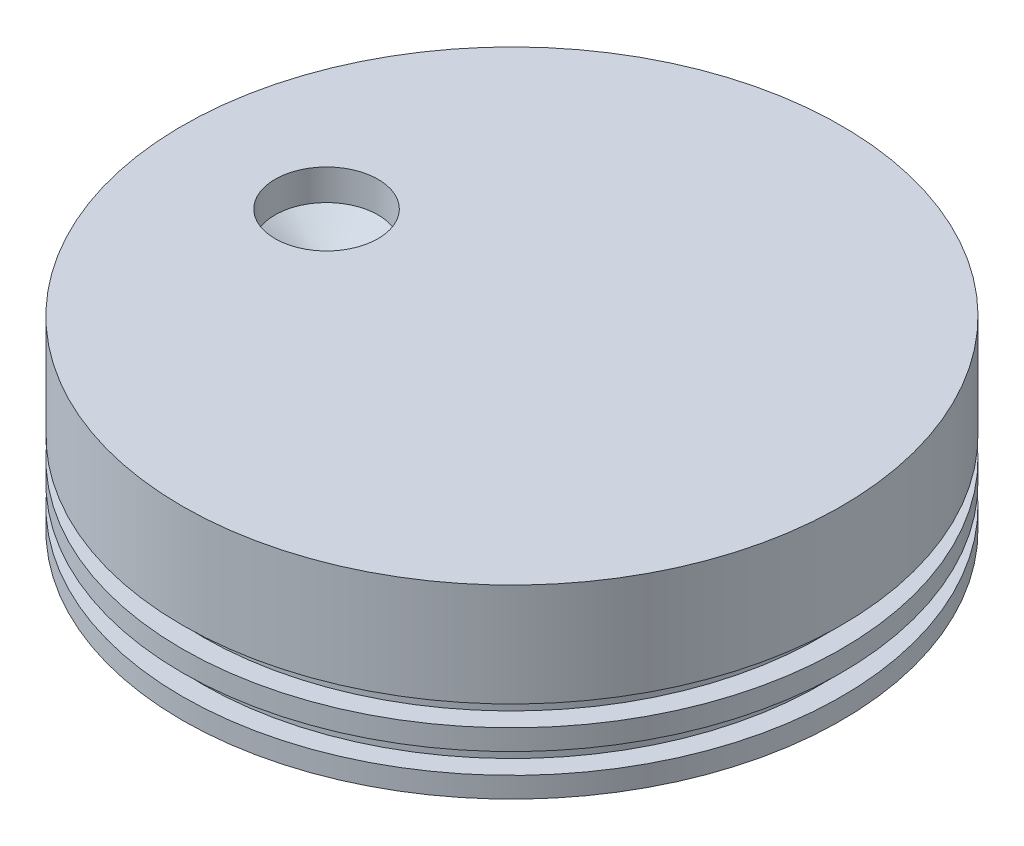
ISO-10303-21;
HEADER;
FILE_DESCRIPTION(('STEP AP214'),'2;1');
FILE_NAME('part.step','',(''),(''),'','','');
FILE_SCHEMA(('AUTOMOTIVE_DESIGN { 1 0 10303 214 1 1 1 1 }'));
ENDSEC;
DATA;
#1=APPLICATION_CONTEXT('core data for automotive mechanical design processes');
#2=APPLICATION_PROTOCOL_DEFINITION('international standard','automotive_design',2000,#1);
#3=PRODUCT_CONTEXT('',#1,'mechanical');
#4=PRODUCT('Part','Part','',(#3));
#5=PRODUCT_RELATED_PRODUCT_CATEGORY('part','',(#4));
#6=PRODUCT_DEFINITION_FORMATION('','',#4);
#7=PRODUCT_DEFINITION_CONTEXT('part definition',#1,'design');
#8=PRODUCT_DEFINITION('design','',#6,#7);
#9=PRODUCT_DEFINITION_SHAPE('','',#8);
#10=(LENGTH_UNIT() NAMED_UNIT(*) SI_UNIT(.MILLI.,.METRE.));
#11=(NAMED_UNIT(*) PLANE_ANGLE_UNIT() SI_UNIT($,.RADIAN.));
#12=(NAMED_UNIT(*) SI_UNIT($,.STERADIAN.) SOLID_ANGLE_UNIT());
#13=UNCERTAINTY_MEASURE_WITH_UNIT(LENGTH_MEASURE(1.E-05),#10,'distance_accuracy_value','');
#14=(GEOMETRIC_REPRESENTATION_CONTEXT(3) GLOBAL_UNCERTAINTY_ASSIGNED_CONTEXT((#13)) GLOBAL_UNIT_ASSIGNED_CONTEXT((#10,
#11,#12)) REPRESENTATION_CONTEXT('',''));
#15=CARTESIAN_POINT('',(0.,0.,0.));
#16=DIRECTION('',(0.,0.,1.));
#17=DIRECTION('',(1.,0.,0.));
#18=AXIS2_PLACEMENT_3D('',#15,#16,#17);
#19=CARTESIAN_POINT('',(20.32,0.,0.));
#20=DIRECTION('',(0.,1.,0.));
#21=DIRECTION('',(0.,0.,1.));
#22=AXIS2_PLACEMENT_3D('',#19,#20,#21);
#23=CYLINDRICAL_SURFACE('',#22,20.32);
#24=CARTESIAN_POINT('',(20.32,-6.35,0.));
#25=DIRECTION('',(0.,1.,0.));
#26=DIRECTION('',(0.,0.,1.));
#27=AXIS2_PLACEMENT_3D('',#24,#25,#26);
#28=CIRCLE('',#27,20.32);
#29=CARTESIAN_POINT('',(20.32,-6.35,20.32));
#30=VERTEX_POINT('',#29);
#31=EDGE_CURVE('E66',#30,#30,#28,.T.);
#32=ORIENTED_EDGE('',*,*,#31,.T.);
#33=EDGE_LOOP('',(#32));
#34=FACE_BOUND('',#33,.T.);
#35=CARTESIAN_POINT('',(20.32,0.,0.));
#36=DIRECTION('',(0.,1.,0.));
#37=DIRECTION('',(0.,0.,1.));
#38=AXIS2_PLACEMENT_3D('',#35,#36,#37);
#39=CIRCLE('',#38,20.32);
#40=CARTESIAN_POINT('',(20.32,0.,20.32));
#41=VERTEX_POINT('',#40);
#42=EDGE_CURVE('E11',#41,#41,#39,.T.);
#43=ORIENTED_EDGE('',*,*,#42,.F.);
#44=EDGE_LOOP('',(#43));
#45=FACE_BOUND('',#44,.T.);
#46=ADVANCED_FACE('F45',(#34,#45),#23,.T.);
#47=CARTESIAN_POINT('',(0.,0.,0.));
#48=DIRECTION('',(0.,1.,0.));
#49=DIRECTION('',(0.,0.,1.));
#50=AXIS2_PLACEMENT_3D('',#47,#48,#49);
#51=PLANE('',#50);
#52=CARTESIAN_POINT('',(8.89,0.,0.));
#53=DIRECTION('',(0.,1.,0.));
#54=DIRECTION('',(0.,0.,1.));
#55=AXIS2_PLACEMENT_3D('',#52,#53,#54);
#56=CIRCLE('',#55,3.17499999999999);
#57=CARTESIAN_POINT('',(8.89,0.,3.17499999999999));
#58=VERTEX_POINT('',#57);
#59=EDGE_CURVE('E67',#58,#58,#56,.T.);
#60=ORIENTED_EDGE('',*,*,#59,.F.);
#61=EDGE_LOOP('',(#60));
#62=FACE_BOUND('',#61,.T.);
#63=ORIENTED_EDGE('',*,*,#42,.T.);
#64=EDGE_LOOP('',(#63));
#65=FACE_BOUND('',#64,.T.);
#66=ADVANCED_FACE('F112',(#62,#65),#51,.T.);
#67=CARTESIAN_POINT('',(20.32,-11.43,0.));
#68=DIRECTION('',(0.,-1.,0.));
#69=DIRECTION('',(0.,0.,-1.));
#70=AXIS2_PLACEMENT_3D('',#67,#68,#69);
#71=PLANE('',#70);
#72=CARTESIAN_POINT('',(20.32,-11.43,0.));
#73=DIRECTION('',(0.,1.,0.));
#74=DIRECTION('',(0.,0.,1.));
#75=AXIS2_PLACEMENT_3D('',#72,#73,#74);
#76=CIRCLE('',#75,20.32);
#77=CARTESIAN_POINT('',(20.32,-11.43,20.32));
#78=VERTEX_POINT('',#77);
#79=EDGE_CURVE('E52',#78,#78,#76,.T.);
#80=ORIENTED_EDGE('',*,*,#79,.F.);
#81=EDGE_LOOP('',(#80));
#82=FACE_BOUND('',#81,.T.);
#83=ADVANCED_FACE('F110',(#82),#71,.T.);
#84=CARTESIAN_POINT('',(20.32,0.,0.));
#85=DIRECTION('',(0.,1.,0.));
#86=DIRECTION('',(0.,0.,1.));
#87=AXIS2_PLACEMENT_3D('',#84,#85,#86);
#88=CYLINDRICAL_SURFACE('',#87,20.32);
#89=ORIENTED_EDGE('',*,*,#79,.T.);
#90=EDGE_LOOP('',(#89));
#91=FACE_BOUND('',#90,.T.);
#92=CARTESIAN_POINT('',(20.32,-10.16,0.));
#93=DIRECTION('',(0.,1.,0.));
#94=DIRECTION('',(0.,0.,1.));
#95=AXIS2_PLACEMENT_3D('',#92,#93,#94);
#96=CIRCLE('',#95,20.32);
#97=CARTESIAN_POINT('',(20.32,-10.16,20.32));
#98=VERTEX_POINT('',#97);
#99=EDGE_CURVE('E100',#98,#98,#96,.T.);
#100=ORIENTED_EDGE('',*,*,#99,.F.);
#101=EDGE_LOOP('',(#100));
#102=FACE_BOUND('',#101,.T.);
#103=ADVANCED_FACE('F107',(#91,#102),#88,.T.);
#104=CARTESIAN_POINT('',(0.,-10.16,0.));
#105=DIRECTION('',(0.,1.,0.));
#106=DIRECTION('',(0.,0.,1.));
#107=AXIS2_PLACEMENT_3D('',#104,#105,#106);
#108=PLANE('',#107);
#109=ORIENTED_EDGE('',*,*,#99,.T.);
#110=EDGE_LOOP('',(#109));
#111=FACE_BOUND('',#110,.T.);
#112=CARTESIAN_POINT('',(20.32,-10.16,0.));
#113=DIRECTION('',(0.,1.,0.));
#114=DIRECTION('',(0.,0.,1.));
#115=AXIS2_PLACEMENT_3D('',#112,#113,#114);
#116=CIRCLE('',#115,19.05);
#117=CARTESIAN_POINT('',(20.32,-10.16,19.05));
#118=VERTEX_POINT('',#117);
#119=EDGE_CURVE('E96',#118,#118,#116,.T.);
#120=ORIENTED_EDGE('',*,*,#119,.F.);
#121=EDGE_LOOP('',(#120));
#122=FACE_BOUND('',#121,.T.);
#123=ADVANCED_FACE('F118',(#111,#122),#108,.T.);
#124=CARTESIAN_POINT('',(20.32,0.,0.));
#125=DIRECTION('',(0.,1.,0.));
#126=DIRECTION('',(0.,0.,1.));
#127=AXIS2_PLACEMENT_3D('',#124,#125,#126);
#128=CYLINDRICAL_SURFACE('',#127,19.05);
#129=ORIENTED_EDGE('',*,*,#119,.T.);
#130=EDGE_LOOP('',(#129));
#131=FACE_BOUND('',#130,.T.);
#132=CARTESIAN_POINT('',(20.32,-8.89,0.));
#133=DIRECTION('',(0.,1.,0.));
#134=DIRECTION('',(0.,0.,1.));
#135=AXIS2_PLACEMENT_3D('',#132,#133,#134);
#136=CIRCLE('',#135,19.05);
#137=CARTESIAN_POINT('',(20.32,-8.89,19.05));
#138=VERTEX_POINT('',#137);
#139=EDGE_CURVE('E92',#138,#138,#136,.T.);
#140=ORIENTED_EDGE('',*,*,#139,.F.);
#141=EDGE_LOOP('',(#140));
#142=FACE_BOUND('',#141,.T.);
#143=ADVANCED_FACE('F152',(#131,#142),#128,.T.);
#144=CARTESIAN_POINT('',(1.27,-8.89,0.));
#145=DIRECTION('',(0.,-1.,0.));
#146=DIRECTION('',(0.,0.,-1.));
#147=AXIS2_PLACEMENT_3D('',#144,#145,#146);
#148=PLANE('',#147);
#149=ORIENTED_EDGE('',*,*,#139,.T.);
#150=EDGE_LOOP('',(#149));
#151=FACE_BOUND('',#150,.T.);
#152=CARTESIAN_POINT('',(20.32,-8.89,0.));
#153=DIRECTION('',(0.,1.,0.));
#154=DIRECTION('',(0.,0.,1.));
#155=AXIS2_PLACEMENT_3D('',#152,#153,#154);
#156=CIRCLE('',#155,20.32);
#157=CARTESIAN_POINT('',(20.32,-8.89,20.32));
#158=VERTEX_POINT('',#157);
#159=EDGE_CURVE('E88',#158,#158,#156,.T.);
#160=ORIENTED_EDGE('',*,*,#159,.F.);
#161=EDGE_LOOP('',(#160));
#162=FACE_BOUND('',#161,.T.);
#163=ADVANCED_FACE('F148',(#151,#162),#148,.T.);
#164=CARTESIAN_POINT('',(20.32,0.,0.));
#165=DIRECTION('',(0.,1.,0.));
#166=DIRECTION('',(0.,0.,1.));
#167=AXIS2_PLACEMENT_3D('',#164,#165,#166);
#168=CYLINDRICAL_SURFACE('',#167,20.32);
#169=ORIENTED_EDGE('',*,*,#159,.T.);
#170=EDGE_LOOP('',(#169));
#171=FACE_BOUND('',#170,.T.);
#172=CARTESIAN_POINT('',(20.32,-7.62,0.));
#173=DIRECTION('',(0.,1.,0.));
#174=DIRECTION('',(0.,0.,1.));
#175=AXIS2_PLACEMENT_3D('',#172,#173,#174);
#176=CIRCLE('',#175,20.32);
#177=CARTESIAN_POINT('',(20.32,-7.62,20.32));
#178=VERTEX_POINT('',#177);
#179=EDGE_CURVE('E84',#178,#178,#176,.T.);
#180=ORIENTED_EDGE('',*,*,#179,.F.);
#181=EDGE_LOOP('',(#180));
#182=FACE_BOUND('',#181,.T.);
#183=ADVANCED_FACE('F144',(#171,#182),#168,.T.);
#184=CARTESIAN_POINT('',(0.,-7.62,0.));
#185=DIRECTION('',(0.,1.,0.));
#186=DIRECTION('',(0.,0.,1.));
#187=AXIS2_PLACEMENT_3D('',#184,#185,#186);
#188=PLANE('',#187);
#189=ORIENTED_EDGE('',*,*,#179,.T.);
#190=EDGE_LOOP('',(#189));
#191=FACE_BOUND('',#190,.T.);
#192=CARTESIAN_POINT('',(20.32,-7.62,0.));
#193=DIRECTION('',(0.,1.,0.));
#194=DIRECTION('',(0.,0.,1.));
#195=AXIS2_PLACEMENT_3D('',#192,#193,#194);
#196=CIRCLE('',#195,19.05);
#197=CARTESIAN_POINT('',(20.32,-7.62,19.05));
#198=VERTEX_POINT('',#197);
#199=EDGE_CURVE('E80',#198,#198,#196,.T.);
#200=ORIENTED_EDGE('',*,*,#199,.F.);
#201=EDGE_LOOP('',(#200));
#202=FACE_BOUND('',#201,.T.);
#203=ADVANCED_FACE('F137',(#191,#202),#188,.T.);
#204=CARTESIAN_POINT('',(20.32,0.,0.));
#205=DIRECTION('',(0.,1.,0.));
#206=DIRECTION('',(0.,0.,1.));
#207=AXIS2_PLACEMENT_3D('',#204,#205,#206);
#208=CYLINDRICAL_SURFACE('',#207,19.05);
#209=ORIENTED_EDGE('',*,*,#199,.T.);
#210=EDGE_LOOP('',(#209));
#211=FACE_BOUND('',#210,.T.);
#212=CARTESIAN_POINT('',(20.32,-6.35,0.));
#213=DIRECTION('',(0.,1.,0.));
#214=DIRECTION('',(0.,0.,1.));
#215=AXIS2_PLACEMENT_3D('',#212,#213,#214);
#216=CIRCLE('',#215,19.05);
#217=CARTESIAN_POINT('',(20.32,-6.35,19.05));
#218=VERTEX_POINT('',#217);
#219=EDGE_CURVE('E72',#218,#218,#216,.T.);
#220=ORIENTED_EDGE('',*,*,#219,.F.);
#221=EDGE_LOOP('',(#220));
#222=FACE_BOUND('',#221,.T.);
#223=ADVANCED_FACE('F131',(#211,#222),#208,.T.);
#224=CARTESIAN_POINT('',(1.27,-6.35,0.));
#225=DIRECTION('',(0.,-1.,0.));
#226=DIRECTION('',(0.,0.,-1.));
#227=AXIS2_PLACEMENT_3D('',#224,#225,#226);
#228=PLANE('',#227);
#229=ORIENTED_EDGE('',*,*,#219,.T.);
#230=EDGE_LOOP('',(#229));
#231=FACE_BOUND('',#230,.T.);
#232=ORIENTED_EDGE('',*,*,#31,.F.);
#233=EDGE_LOOP('',(#232));
#234=FACE_BOUND('',#233,.T.);
#235=ADVANCED_FACE('F59',(#231,#234),#228,.T.);
#236=CARTESIAN_POINT('',(8.89,-1.90226753458749,0.));
#237=DIRECTION('',(0.,1.,0.));
#238=DIRECTION('',(0.,0.,1.));
#239=AXIS2_PLACEMENT_3D('',#236,#237,#238);
#240=CONICAL_SURFACE('',#239,3.175,1.02974425867665);
#241=CARTESIAN_POINT('',(8.89,-3.81,0.));
#242=VERTEX_POINT('',#241);
#243=VERTEX_LOOP('',#242);
#244=FACE_BOUND('',#243,.T.);
#245=CARTESIAN_POINT('',(8.89,-1.90226753458749,0.));
#246=DIRECTION('',(0.,1.,0.));
#247=DIRECTION('',(0.,0.,1.));
#248=AXIS2_PLACEMENT_3D('',#245,#246,#247);
#249=CIRCLE('',#248,3.175);
#250=CARTESIAN_POINT('',(8.89,-1.90226753458749,3.175));
#251=VERTEX_POINT('',#250);
#252=EDGE_CURVE('E63',#251,#251,#249,.T.);
#253=ORIENTED_EDGE('',*,*,#252,.T.);
#254=EDGE_LOOP('',(#253));
#255=FACE_BOUND('',#254,.T.);
#256=ADVANCED_FACE('F55',(#244,#255),#240,.F.);
#257=CARTESIAN_POINT('',(8.89,0.,0.));
#258=DIRECTION('',(0.,1.,0.));
#259=DIRECTION('',(0.,0.,1.));
#260=AXIS2_PLACEMENT_3D('',#257,#258,#259);
#261=CYLINDRICAL_SURFACE('',#260,3.17499999999999);
#262=ORIENTED_EDGE('',*,*,#252,.F.);
#263=EDGE_LOOP('',(#262));
#264=FACE_BOUND('',#263,.T.);
#265=ORIENTED_EDGE('',*,*,#59,.T.);
#266=EDGE_LOOP('',(#265));
#267=FACE_BOUND('',#266,.T.);
#268=ADVANCED_FACE('F58',(#264,#267),#261,.F.);
#269=CLOSED_SHELL('',(#46,#66,#83,#103,#123,#143,#163,#183,#203,#223,#235,#256,#268));
#270=MANIFOLD_SOLID_BREP('B2',#269);
#271=ADVANCED_BREP_SHAPE_REPRESENTATION('',(#18,#270),#14);
#272=SHAPE_DEFINITION_REPRESENTATION(#9,#271);
ENDSEC;
END-ISO-10303-21;
